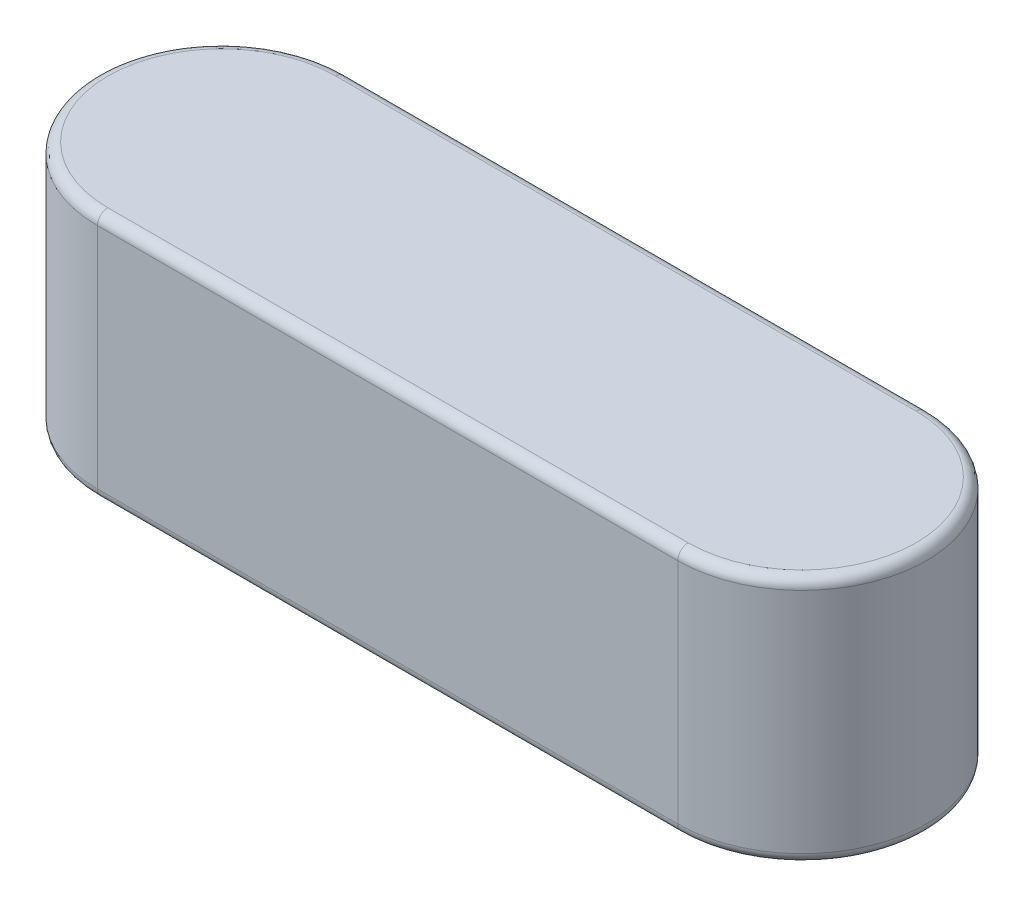
ISO-10303-21;
HEADER;
FILE_DESCRIPTION(('STEP AP214'),'2;1');
FILE_NAME('part.step','',(''),(''),'','','');
FILE_SCHEMA(('AUTOMOTIVE_DESIGN { 1 0 10303 214 1 1 1 1 }'));
ENDSEC;
DATA;
#1=APPLICATION_CONTEXT('core data for automotive mechanical design processes');
#2=APPLICATION_PROTOCOL_DEFINITION('international standard','automotive_design',2000,#1);
#3=PRODUCT_CONTEXT('',#1,'mechanical');
#4=PRODUCT('Part','Part','',(#3));
#5=PRODUCT_RELATED_PRODUCT_CATEGORY('part','',(#4));
#6=PRODUCT_DEFINITION_FORMATION('','',#4);
#7=PRODUCT_DEFINITION_CONTEXT('part definition',#1,'design');
#8=PRODUCT_DEFINITION('design','',#6,#7);
#9=PRODUCT_DEFINITION_SHAPE('','',#8);
#10=(LENGTH_UNIT() NAMED_UNIT(*) SI_UNIT(.MILLI.,.METRE.));
#11=(NAMED_UNIT(*) PLANE_ANGLE_UNIT() SI_UNIT($,.RADIAN.));
#12=(NAMED_UNIT(*) SI_UNIT($,.STERADIAN.) SOLID_ANGLE_UNIT());
#13=UNCERTAINTY_MEASURE_WITH_UNIT(LENGTH_MEASURE(1.E-05),#10,'distance_accuracy_value','');
#14=(GEOMETRIC_REPRESENTATION_CONTEXT(3) GLOBAL_UNCERTAINTY_ASSIGNED_CONTEXT((#13)) GLOBAL_UNIT_ASSIGNED_CONTEXT((#10,
#11,#12)) REPRESENTATION_CONTEXT('',''));
#15=CARTESIAN_POINT('',(0.,0.,0.));
#16=DIRECTION('',(0.,0.,1.));
#17=DIRECTION('',(1.,0.,0.));
#18=AXIS2_PLACEMENT_3D('',#15,#16,#17);
#19=CARTESIAN_POINT('',(-14.,6.,0.));
#20=DIRECTION('',(0.,-1.,0.));
#21=DIRECTION('',(0.,0.,-1.));
#22=AXIS2_PLACEMENT_3D('',#19,#20,#21);
#23=CYLINDRICAL_SURFACE('',#22,3.);
#24=DIRECTION('',(0.,-1.,0.));
#25=VECTOR('',#24,1.);
#26=CARTESIAN_POINT('',(-14.,6.,-3.));
#27=LINE('',#26,#25);
#28=CARTESIAN_POINT('',(-14.,5.75,-3.));
#29=VERTEX_POINT('',#28);
#30=CARTESIAN_POINT('',(-14.,0.25,-3.));
#31=VERTEX_POINT('',#30);
#32=EDGE_CURVE('E111',#29,#31,#27,.T.);
#33=ORIENTED_EDGE('',*,*,#32,.T.);
#34=CARTESIAN_POINT('',(-14.,0.25,0.));
#35=DIRECTION('',(0.,1.,0.));
#36=DIRECTION('',(0.,0.,1.));
#37=AXIS2_PLACEMENT_3D('',#34,#35,#36);
#38=CIRCLE('',#37,3.);
#39=CARTESIAN_POINT('',(-14.,0.25,3.));
#40=VERTEX_POINT('',#39);
#41=EDGE_CURVE('E119',#31,#40,#38,.T.);
#42=ORIENTED_EDGE('',*,*,#41,.T.);
#43=DIRECTION('',(0.,-1.,0.));
#44=VECTOR('',#43,1.);
#45=CARTESIAN_POINT('',(-14.,6.,3.));
#46=LINE('',#45,#44);
#47=CARTESIAN_POINT('',(-14.,5.75,3.));
#48=VERTEX_POINT('',#47);
#49=EDGE_CURVE('E113',#48,#40,#46,.T.);
#50=ORIENTED_EDGE('',*,*,#49,.F.);
#51=CARTESIAN_POINT('',(-14.,5.75,0.));
#52=DIRECTION('',(0.,1.,0.));
#53=DIRECTION('',(0.,0.,1.));
#54=AXIS2_PLACEMENT_3D('',#51,#52,#53);
#55=CIRCLE('',#54,3.);
#56=EDGE_CURVE('E109',#48,#29,#55,.F.);
#57=ORIENTED_EDGE('',*,*,#56,.T.);
#58=EDGE_LOOP('',(#33,#42,#50,#57));
#59=FACE_BOUND('',#58,.T.);
#60=ADVANCED_FACE('F39',(#59),#23,.T.);
#61=CARTESIAN_POINT('',(-14.,6.,3.));
#62=DIRECTION('',(0.,0.,-1.));
#63=DIRECTION('',(-1.,0.,0.));
#64=AXIS2_PLACEMENT_3D('',#61,#62,#63);
#65=PLANE('',#64);
#66=ORIENTED_EDGE('',*,*,#49,.T.);
#67=DIRECTION('',(1.,0.,0.));
#68=VECTOR('',#67,1.);
#69=CARTESIAN_POINT('',(-14.,0.25,3.));
#70=LINE('',#69,#68);
#71=CARTESIAN_POINT('',(0.,0.25,3.));
#72=VERTEX_POINT('',#71);
#73=EDGE_CURVE('E176',#40,#72,#70,.T.);
#74=ORIENTED_EDGE('',*,*,#73,.T.);
#75=DIRECTION('',(0.,-1.,0.));
#76=VECTOR('',#75,1.);
#77=CARTESIAN_POINT('',(0.,6.,3.));
#78=LINE('',#77,#76);
#79=CARTESIAN_POINT('',(0.,5.75,3.));
#80=VERTEX_POINT('',#79);
#81=EDGE_CURVE('E149',#80,#72,#78,.T.);
#82=ORIENTED_EDGE('',*,*,#81,.F.);
#83=DIRECTION('',(1.,0.,0.));
#84=VECTOR('',#83,1.);
#85=CARTESIAN_POINT('',(-14.,5.75,3.));
#86=LINE('',#85,#84);
#87=EDGE_CURVE('E173',#80,#48,#86,.F.);
#88=ORIENTED_EDGE('',*,*,#87,.T.);
#89=EDGE_LOOP('',(#66,#74,#82,#88));
#90=FACE_BOUND('',#89,.T.);
#91=ADVANCED_FACE('F212',(#90),#65,.F.);
#92=CARTESIAN_POINT('',(0.,6.,0.));
#93=DIRECTION('',(0.,-1.,0.));
#94=DIRECTION('',(0.,0.,-1.));
#95=AXIS2_PLACEMENT_3D('',#92,#93,#94);
#96=CYLINDRICAL_SURFACE('',#95,3.);
#97=ORIENTED_EDGE('',*,*,#81,.T.);
#98=CARTESIAN_POINT('',(0.,0.25,0.));
#99=DIRECTION('',(0.,1.,0.));
#100=DIRECTION('',(0.,0.,1.));
#101=AXIS2_PLACEMENT_3D('',#98,#99,#100);
#102=CIRCLE('',#101,3.);
#103=CARTESIAN_POINT('',(0.,0.25,-3.));
#104=VERTEX_POINT('',#103);
#105=EDGE_CURVE('E120',#72,#104,#102,.T.);
#106=ORIENTED_EDGE('',*,*,#105,.T.);
#107=DIRECTION('',(0.,-1.,0.));
#108=VECTOR('',#107,1.);
#109=CARTESIAN_POINT('',(0.,6.,-3.));
#110=LINE('',#109,#108);
#111=CARTESIAN_POINT('',(0.,5.75,-3.));
#112=VERTEX_POINT('',#111);
#113=EDGE_CURVE('E132',#112,#104,#110,.T.);
#114=ORIENTED_EDGE('',*,*,#113,.F.);
#115=CARTESIAN_POINT('',(0.,5.75,0.));
#116=DIRECTION('',(0.,1.,0.));
#117=DIRECTION('',(0.,0.,1.));
#118=AXIS2_PLACEMENT_3D('',#115,#116,#117);
#119=CIRCLE('',#118,3.);
#120=EDGE_CURVE('E165',#112,#80,#119,.F.);
#121=ORIENTED_EDGE('',*,*,#120,.T.);
#122=EDGE_LOOP('',(#97,#106,#114,#121));
#123=FACE_BOUND('',#122,.T.);
#124=ADVANCED_FACE('F210',(#123),#96,.T.);
#125=CARTESIAN_POINT('',(-14.,6.,-3.));
#126=DIRECTION('',(0.,0.,1.));
#127=DIRECTION('',(1.,0.,0.));
#128=AXIS2_PLACEMENT_3D('',#125,#126,#127);
#129=PLANE('',#128);
#130=ORIENTED_EDGE('',*,*,#113,.T.);
#131=DIRECTION('',(-1.,0.,0.));
#132=VECTOR('',#131,1.);
#133=CARTESIAN_POINT('',(-14.,0.25,-3.));
#134=LINE('',#133,#132);
#135=EDGE_CURVE('E130',#104,#31,#134,.T.);
#136=ORIENTED_EDGE('',*,*,#135,.T.);
#137=ORIENTED_EDGE('',*,*,#32,.F.);
#138=DIRECTION('',(-1.,0.,0.));
#139=VECTOR('',#138,1.);
#140=CARTESIAN_POINT('',(0.,5.75,-3.));
#141=LINE('',#140,#139);
#142=EDGE_CURVE('E127',#29,#112,#141,.F.);
#143=ORIENTED_EDGE('',*,*,#142,.T.);
#144=EDGE_LOOP('',(#130,#136,#137,#143));
#145=FACE_BOUND('',#144,.T.);
#146=ADVANCED_FACE('F125',(#145),#129,.F.);
#147=CARTESIAN_POINT('',(-14.,6.,0.));
#148=DIRECTION('',(0.,1.,0.));
#149=DIRECTION('',(0.,0.,1.));
#150=AXIS2_PLACEMENT_3D('',#147,#148,#149);
#151=PLANE('',#150);
#152=DIRECTION('',(1.,0.,0.));
#153=VECTOR('',#152,1.);
#154=CARTESIAN_POINT('',(0.,6.,2.75));
#155=LINE('',#154,#153);
#156=CARTESIAN_POINT('',(-14.,6.,2.75));
#157=VERTEX_POINT('',#156);
#158=CARTESIAN_POINT('',(0.,6.,2.75));
#159=VERTEX_POINT('',#158);
#160=EDGE_CURVE('E49',#157,#159,#155,.T.);
#161=ORIENTED_EDGE('',*,*,#160,.T.);
#162=CARTESIAN_POINT('',(0.,6.,0.));
#163=DIRECTION('',(0.,1.,0.));
#164=DIRECTION('',(0.,0.,1.));
#165=AXIS2_PLACEMENT_3D('',#162,#163,#164);
#166=CIRCLE('',#165,2.75);
#167=CARTESIAN_POINT('',(0.,6.,-2.75));
#168=VERTEX_POINT('',#167);
#169=EDGE_CURVE('E11',#159,#168,#166,.T.);
#170=ORIENTED_EDGE('',*,*,#169,.T.);
#171=DIRECTION('',(-1.,0.,0.));
#172=VECTOR('',#171,1.);
#173=CARTESIAN_POINT('',(-14.,6.,-2.75));
#174=LINE('',#173,#172);
#175=CARTESIAN_POINT('',(-14.,6.,-2.75));
#176=VERTEX_POINT('',#175);
#177=EDGE_CURVE('E181',#168,#176,#174,.T.);
#178=ORIENTED_EDGE('',*,*,#177,.T.);
#179=CARTESIAN_POINT('',(-14.,6.,0.));
#180=DIRECTION('',(0.,1.,0.));
#181=DIRECTION('',(0.,0.,1.));
#182=AXIS2_PLACEMENT_3D('',#179,#180,#181);
#183=CIRCLE('',#182,2.75);
#184=EDGE_CURVE('E138',#176,#157,#183,.T.);
#185=ORIENTED_EDGE('',*,*,#184,.T.);
#186=EDGE_LOOP('',(#161,#170,#178,#185));
#187=FACE_BOUND('',#186,.T.);
#188=ADVANCED_FACE('F237',(#187),#151,.T.);
#189=CARTESIAN_POINT('',(-14.,0.,0.));
#190=DIRECTION('',(0.,1.,0.));
#191=DIRECTION('',(0.,0.,1.));
#192=AXIS2_PLACEMENT_3D('',#189,#190,#191);
#193=PLANE('',#192);
#194=CARTESIAN_POINT('',(-14.,0.,0.));
#195=DIRECTION('',(0.,1.,0.));
#196=DIRECTION('',(0.,0.,1.));
#197=AXIS2_PLACEMENT_3D('',#194,#195,#196);
#198=CIRCLE('',#197,2.75);
#199=CARTESIAN_POINT('',(-14.,0.,2.75));
#200=VERTEX_POINT('',#199);
#201=CARTESIAN_POINT('',(-14.,0.,-2.75));
#202=VERTEX_POINT('',#201);
#203=EDGE_CURVE('E155',#200,#202,#198,.F.);
#204=ORIENTED_EDGE('',*,*,#203,.T.);
#205=DIRECTION('',(-1.,0.,0.));
#206=VECTOR('',#205,1.);
#207=CARTESIAN_POINT('',(-14.,0.,-2.75));
#208=LINE('',#207,#206);
#209=CARTESIAN_POINT('',(0.,0.,-2.75));
#210=VERTEX_POINT('',#209);
#211=EDGE_CURVE('E161',#202,#210,#208,.F.);
#212=ORIENTED_EDGE('',*,*,#211,.T.);
#213=CARTESIAN_POINT('',(0.,0.,0.));
#214=DIRECTION('',(0.,1.,0.));
#215=DIRECTION('',(0.,0.,1.));
#216=AXIS2_PLACEMENT_3D('',#213,#214,#215);
#217=CIRCLE('',#216,2.75);
#218=CARTESIAN_POINT('',(0.,0.,2.75));
#219=VERTEX_POINT('',#218);
#220=EDGE_CURVE('E158',#210,#219,#217,.F.);
#221=ORIENTED_EDGE('',*,*,#220,.T.);
#222=DIRECTION('',(1.,0.,0.));
#223=VECTOR('',#222,1.);
#224=CARTESIAN_POINT('',(-14.,0.,2.75));
#225=LINE('',#224,#223);
#226=EDGE_CURVE('E147',#219,#200,#225,.F.);
#227=ORIENTED_EDGE('',*,*,#226,.T.);
#228=EDGE_LOOP('',(#204,#212,#221,#227));
#229=FACE_BOUND('',#228,.T.);
#230=ADVANCED_FACE('F235',(#229),#193,.F.);
#231=CARTESIAN_POINT('',(-14.,0.25,2.75));
#232=DIRECTION('',(1.,0.,0.));
#233=DIRECTION('',(0.,0.,-1.));
#234=AXIS2_PLACEMENT_3D('',#231,#232,#233);
#235=CYLINDRICAL_SURFACE('',#234,0.25);
#236=CARTESIAN_POINT('',(-14.,0.25,2.75));
#237=DIRECTION('',(-1.,0.,0.));
#238=DIRECTION('',(0.,0.,1.));
#239=AXIS2_PLACEMENT_3D('',#236,#237,#238);
#240=CIRCLE('',#239,0.25);
#241=EDGE_CURVE('E192',#200,#40,#240,.T.);
#242=ORIENTED_EDGE('',*,*,#241,.F.);
#243=ORIENTED_EDGE('',*,*,#226,.F.);
#244=CARTESIAN_POINT('',(0.,0.25,2.75));
#245=DIRECTION('',(1.,0.,0.));
#246=DIRECTION('',(0.,0.,-1.));
#247=AXIS2_PLACEMENT_3D('',#244,#245,#246);
#248=CIRCLE('',#247,0.25);
#249=EDGE_CURVE('E133',#72,#219,#248,.T.);
#250=ORIENTED_EDGE('',*,*,#249,.F.);
#251=ORIENTED_EDGE('',*,*,#73,.F.);
#252=EDGE_LOOP('',(#242,#243,#250,#251));
#253=FACE_BOUND('',#252,.T.);
#254=ADVANCED_FACE('F232',(#253),#235,.T.);
#255=CARTESIAN_POINT('',(0.,0.25,0.));
#256=DIRECTION('',(0.,1.,0.));
#257=DIRECTION('',(0.,0.,1.));
#258=AXIS2_PLACEMENT_3D('',#255,#256,#257);
#259=TOROIDAL_SURFACE('',#258,2.75,0.25);
#260=ORIENTED_EDGE('',*,*,#249,.T.);
#261=ORIENTED_EDGE('',*,*,#220,.F.);
#262=CARTESIAN_POINT('',(0.,0.25,-2.75));
#263=DIRECTION('',(-1.,0.,0.));
#264=DIRECTION('',(0.,0.,1.));
#265=AXIS2_PLACEMENT_3D('',#262,#263,#264);
#266=CIRCLE('',#265,0.25);
#267=EDGE_CURVE('E189',#104,#210,#266,.T.);
#268=ORIENTED_EDGE('',*,*,#267,.F.);
#269=ORIENTED_EDGE('',*,*,#105,.F.);
#270=EDGE_LOOP('',(#260,#261,#268,#269));
#271=FACE_BOUND('',#270,.T.);
#272=ADVANCED_FACE('F221',(#271),#259,.T.);
#273=CARTESIAN_POINT('',(-14.,0.25,0.));
#274=DIRECTION('',(0.,1.,0.));
#275=DIRECTION('',(0.,0.,1.));
#276=AXIS2_PLACEMENT_3D('',#273,#274,#275);
#277=TOROIDAL_SURFACE('',#276,2.75,0.25);
#278=ORIENTED_EDGE('',*,*,#241,.T.);
#279=ORIENTED_EDGE('',*,*,#41,.F.);
#280=CARTESIAN_POINT('',(-14.,0.25,-2.75));
#281=DIRECTION('',(1.,0.,0.));
#282=DIRECTION('',(0.,0.,-1.));
#283=AXIS2_PLACEMENT_3D('',#280,#281,#282);
#284=CIRCLE('',#283,0.25);
#285=EDGE_CURVE('E186',#202,#31,#284,.T.);
#286=ORIENTED_EDGE('',*,*,#285,.F.);
#287=ORIENTED_EDGE('',*,*,#203,.F.);
#288=EDGE_LOOP('',(#278,#279,#286,#287));
#289=FACE_BOUND('',#288,.T.);
#290=ADVANCED_FACE('F229',(#289),#277,.T.);
#291=CARTESIAN_POINT('',(-14.,0.25,-2.75));
#292=DIRECTION('',(-1.,0.,0.));
#293=DIRECTION('',(0.,0.,1.));
#294=AXIS2_PLACEMENT_3D('',#291,#292,#293);
#295=CYLINDRICAL_SURFACE('',#294,0.25);
#296=ORIENTED_EDGE('',*,*,#267,.T.);
#297=ORIENTED_EDGE('',*,*,#211,.F.);
#298=ORIENTED_EDGE('',*,*,#285,.T.);
#299=ORIENTED_EDGE('',*,*,#135,.F.);
#300=EDGE_LOOP('',(#296,#297,#298,#299));
#301=FACE_BOUND('',#300,.T.);
#302=ADVANCED_FACE('F224',(#301),#295,.T.);
#303=CARTESIAN_POINT('',(-14.,5.75,0.));
#304=DIRECTION('',(0.,1.,0.));
#305=DIRECTION('',(0.,0.,1.));
#306=AXIS2_PLACEMENT_3D('',#303,#304,#305);
#307=TOROIDAL_SURFACE('',#306,2.75,0.25);
#308=CARTESIAN_POINT('',(-14.,5.75,-2.75));
#309=DIRECTION('',(1.,0.,0.));
#310=DIRECTION('',(0.,0.,-1.));
#311=AXIS2_PLACEMENT_3D('',#308,#309,#310);
#312=CIRCLE('',#311,0.25);
#313=EDGE_CURVE('E137',#29,#176,#312,.T.);
#314=ORIENTED_EDGE('',*,*,#313,.F.);
#315=ORIENTED_EDGE('',*,*,#56,.F.);
#316=CARTESIAN_POINT('',(-14.,5.75,2.75));
#317=DIRECTION('',(1.,0.,0.));
#318=DIRECTION('',(0.,0.,-1.));
#319=AXIS2_PLACEMENT_3D('',#316,#317,#318);
#320=CIRCLE('',#319,0.25);
#321=EDGE_CURVE('E43',#157,#48,#320,.T.);
#322=ORIENTED_EDGE('',*,*,#321,.F.);
#323=ORIENTED_EDGE('',*,*,#184,.F.);
#324=EDGE_LOOP('',(#314,#315,#322,#323));
#325=FACE_BOUND('',#324,.T.);
#326=ADVANCED_FACE('F41',(#325),#307,.T.);
#327=CARTESIAN_POINT('',(-14.,5.75,2.75));
#328=DIRECTION('',(-1.,0.,0.));
#329=DIRECTION('',(0.,0.,1.));
#330=AXIS2_PLACEMENT_3D('',#327,#328,#329);
#331=CYLINDRICAL_SURFACE('',#330,0.25);
#332=ORIENTED_EDGE('',*,*,#321,.T.);
#333=ORIENTED_EDGE('',*,*,#87,.F.);
#334=CARTESIAN_POINT('',(0.,5.75,2.75));
#335=DIRECTION('',(1.,0.,0.));
#336=DIRECTION('',(0.,0.,-1.));
#337=AXIS2_PLACEMENT_3D('',#334,#335,#336);
#338=CIRCLE('',#337,0.25);
#339=EDGE_CURVE('E141',#159,#80,#338,.T.);
#340=ORIENTED_EDGE('',*,*,#339,.F.);
#341=ORIENTED_EDGE('',*,*,#160,.F.);
#342=EDGE_LOOP('',(#332,#333,#340,#341));
#343=FACE_BOUND('',#342,.T.);
#344=ADVANCED_FACE('F205',(#343),#331,.T.);
#345=CARTESIAN_POINT('',(-14.,5.75,-2.75));
#346=DIRECTION('',(1.,0.,0.));
#347=DIRECTION('',(0.,0.,-1.));
#348=AXIS2_PLACEMENT_3D('',#345,#346,#347);
#349=CYLINDRICAL_SURFACE('',#348,0.25);
#350=ORIENTED_EDGE('',*,*,#313,.T.);
#351=ORIENTED_EDGE('',*,*,#177,.F.);
#352=CARTESIAN_POINT('',(0.,5.75,-2.75));
#353=DIRECTION('',(1.,0.,0.));
#354=DIRECTION('',(0.,0.,-1.));
#355=AXIS2_PLACEMENT_3D('',#352,#353,#354);
#356=CIRCLE('',#355,0.25);
#357=EDGE_CURVE('E63',#112,#168,#356,.T.);
#358=ORIENTED_EDGE('',*,*,#357,.F.);
#359=ORIENTED_EDGE('',*,*,#142,.F.);
#360=EDGE_LOOP('',(#350,#351,#358,#359));
#361=FACE_BOUND('',#360,.T.);
#362=ADVANCED_FACE('F142',(#361),#349,.T.);
#363=CARTESIAN_POINT('',(0.,5.75,0.));
#364=DIRECTION('',(0.,1.,0.));
#365=DIRECTION('',(0.,0.,1.));
#366=AXIS2_PLACEMENT_3D('',#363,#364,#365);
#367=TOROIDAL_SURFACE('',#366,2.75,0.25);
#368=ORIENTED_EDGE('',*,*,#339,.T.);
#369=ORIENTED_EDGE('',*,*,#120,.F.);
#370=ORIENTED_EDGE('',*,*,#357,.T.);
#371=ORIENTED_EDGE('',*,*,#169,.F.);
#372=EDGE_LOOP('',(#368,#369,#370,#371));
#373=FACE_BOUND('',#372,.T.);
#374=ADVANCED_FACE('F203',(#373),#367,.T.);
#375=CLOSED_SHELL('',(#60,#91,#124,#146,#188,#230,#254,#272,#290,#302,#326,#344,#362,#374));
#376=MANIFOLD_SOLID_BREP('B2',#375);
#377=ADVANCED_BREP_SHAPE_REPRESENTATION('',(#18,#376),#14);
#378=SHAPE_DEFINITION_REPRESENTATION(#9,#377);
ENDSEC;
END-ISO-10303-21;
